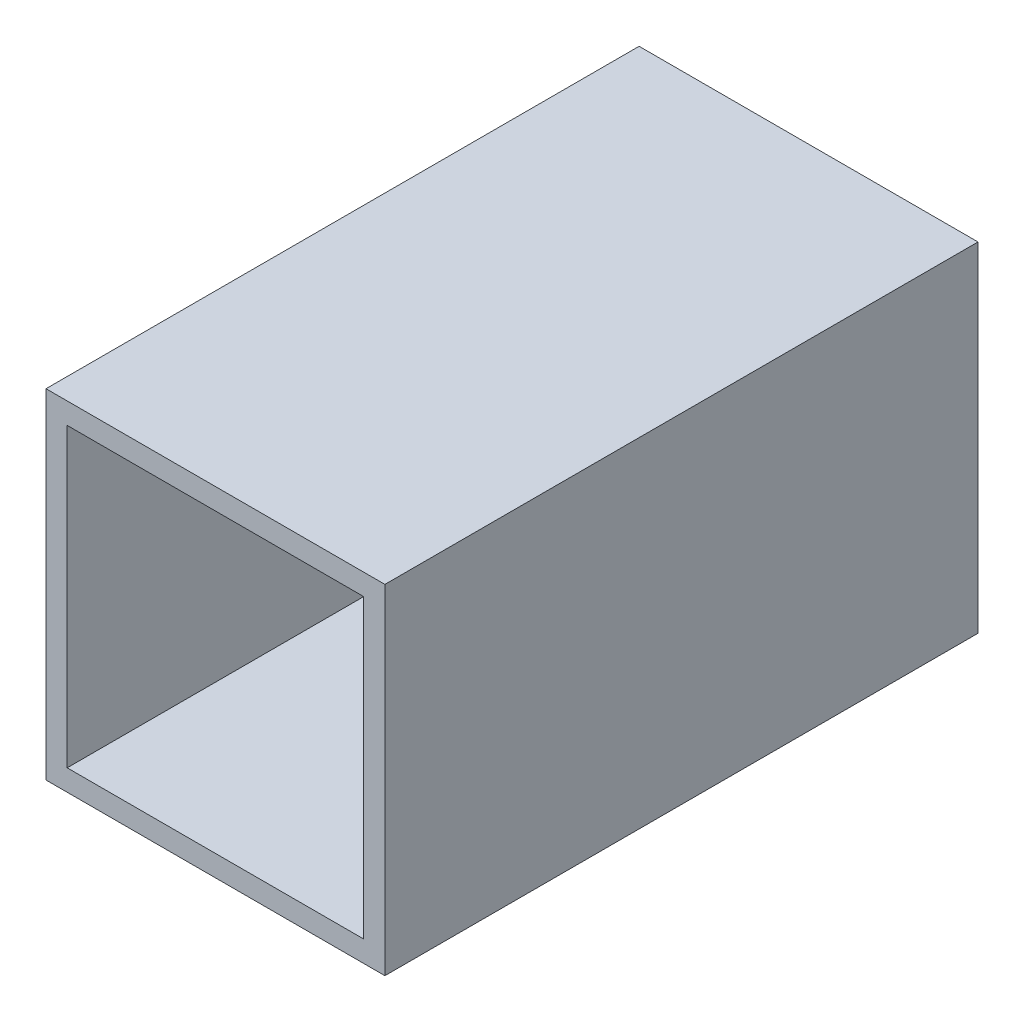
ISO-10303-21;
HEADER;
FILE_DESCRIPTION(('STEP AP214'),'2;1');
FILE_NAME('part.step','',(''),(''),'','','');
FILE_SCHEMA(('AUTOMOTIVE_DESIGN { 1 0 10303 214 1 1 1 1 }'));
ENDSEC;
DATA;
#1=APPLICATION_CONTEXT('core data for automotive mechanical design processes');
#2=APPLICATION_PROTOCOL_DEFINITION('international standard','automotive_design',2000,#1);
#3=PRODUCT_CONTEXT('',#1,'mechanical');
#4=PRODUCT('Part','Part','',(#3));
#5=PRODUCT_RELATED_PRODUCT_CATEGORY('part','',(#4));
#6=PRODUCT_DEFINITION_FORMATION('','',#4);
#7=PRODUCT_DEFINITION_CONTEXT('part definition',#1,'design');
#8=PRODUCT_DEFINITION('design','',#6,#7);
#9=PRODUCT_DEFINITION_SHAPE('','',#8);
#10=(LENGTH_UNIT() NAMED_UNIT(*) SI_UNIT(.MILLI.,.METRE.));
#11=(NAMED_UNIT(*) PLANE_ANGLE_UNIT() SI_UNIT($,.RADIAN.));
#12=(NAMED_UNIT(*) SI_UNIT($,.STERADIAN.) SOLID_ANGLE_UNIT());
#13=UNCERTAINTY_MEASURE_WITH_UNIT(LENGTH_MEASURE(1.E-05),#10,'distance_accuracy_value','');
#14=(GEOMETRIC_REPRESENTATION_CONTEXT(3) GLOBAL_UNCERTAINTY_ASSIGNED_CONTEXT((#13)) GLOBAL_UNIT_ASSIGNED_CONTEXT((#10,
#11,#12)) REPRESENTATION_CONTEXT('',''));
#15=CARTESIAN_POINT('',(0.,0.,0.));
#16=DIRECTION('',(0.,0.,1.));
#17=DIRECTION('',(1.,0.,0.));
#18=AXIS2_PLACEMENT_3D('',#15,#16,#17);
#19=CARTESIAN_POINT('',(0.,0.,44.45));
#20=DIRECTION('',(0.,0.,1.));
#21=DIRECTION('',(1.,0.,0.));
#22=AXIS2_PLACEMENT_3D('',#19,#20,#21);
#23=PLANE('',#22);
#24=DIRECTION('',(0.,1.,0.));
#25=VECTOR('',#24,1.);
#26=CARTESIAN_POINT('',(12.7,12.7,44.45));
#27=LINE('',#26,#25);
#28=CARTESIAN_POINT('',(12.7,-12.7,44.45));
#29=VERTEX_POINT('',#28);
#30=CARTESIAN_POINT('',(12.7,12.7,44.45));
#31=VERTEX_POINT('',#30);
#32=EDGE_CURVE('E135',#29,#31,#27,.T.);
#33=ORIENTED_EDGE('',*,*,#32,.T.);
#34=DIRECTION('',(-1.,0.,0.));
#35=VECTOR('',#34,1.);
#36=CARTESIAN_POINT('',(-12.7,12.7,44.45));
#37=LINE('',#36,#35);
#38=CARTESIAN_POINT('',(-12.7,12.7,44.45));
#39=VERTEX_POINT('',#38);
#40=EDGE_CURVE('E138',#31,#39,#37,.T.);
#41=ORIENTED_EDGE('',*,*,#40,.T.);
#42=DIRECTION('',(0.,-1.,0.));
#43=VECTOR('',#42,1.);
#44=CARTESIAN_POINT('',(-12.7,12.7,44.45));
#45=LINE('',#44,#43);
#46=CARTESIAN_POINT('',(-12.7,-12.7,44.45));
#47=VERTEX_POINT('',#46);
#48=EDGE_CURVE('E141',#39,#47,#45,.T.);
#49=ORIENTED_EDGE('',*,*,#48,.T.);
#50=DIRECTION('',(1.,0.,0.));
#51=VECTOR('',#50,1.);
#52=CARTESIAN_POINT('',(-12.7,-12.7,44.45));
#53=LINE('',#52,#51);
#54=EDGE_CURVE('E143',#47,#29,#53,.T.);
#55=ORIENTED_EDGE('',*,*,#54,.T.);
#56=EDGE_LOOP('',(#33,#41,#49,#55));
#57=FACE_BOUND('',#56,.T.);
#58=DIRECTION('',(1.,0.,0.));
#59=VECTOR('',#58,1.);
#60=CARTESIAN_POINT('',(11.1125,-11.1125,44.45));
#61=LINE('',#60,#59);
#62=CARTESIAN_POINT('',(-11.1125,-11.1125,44.45));
#63=VERTEX_POINT('',#62);
#64=CARTESIAN_POINT('',(11.1125,-11.1125,44.45));
#65=VERTEX_POINT('',#64);
#66=EDGE_CURVE('E107',#63,#65,#61,.T.);
#67=ORIENTED_EDGE('',*,*,#66,.F.);
#68=DIRECTION('',(0.,-1.,0.));
#69=VECTOR('',#68,1.);
#70=CARTESIAN_POINT('',(-11.1125,-11.1125,44.45));
#71=LINE('',#70,#69);
#72=CARTESIAN_POINT('',(-11.1125,11.1125,44.45));
#73=VERTEX_POINT('',#72);
#74=EDGE_CURVE('E99',#73,#63,#71,.T.);
#75=ORIENTED_EDGE('',*,*,#74,.F.);
#76=DIRECTION('',(-1.,0.,0.));
#77=VECTOR('',#76,1.);
#78=CARTESIAN_POINT('',(11.1125,11.1125,44.45));
#79=LINE('',#78,#77);
#80=CARTESIAN_POINT('',(11.1125,11.1125,44.45));
#81=VERTEX_POINT('',#80);
#82=EDGE_CURVE('E121',#81,#73,#79,.T.);
#83=ORIENTED_EDGE('',*,*,#82,.F.);
#84=DIRECTION('',(0.,1.,0.));
#85=VECTOR('',#84,1.);
#86=CARTESIAN_POINT('',(11.1125,-11.1125,44.45));
#87=LINE('',#86,#85);
#88=EDGE_CURVE('E119',#65,#81,#87,.T.);
#89=ORIENTED_EDGE('',*,*,#88,.F.);
#90=EDGE_LOOP('',(#67,#75,#83,#89));
#91=FACE_BOUND('',#90,.T.);
#92=ADVANCED_FACE('F34',(#57,#91),#23,.T.);
#93=CARTESIAN_POINT('',(0.,0.,0.));
#94=DIRECTION('',(0.,0.,1.));
#95=DIRECTION('',(1.,0.,0.));
#96=AXIS2_PLACEMENT_3D('',#93,#94,#95);
#97=PLANE('',#96);
#98=DIRECTION('',(0.,1.,0.));
#99=VECTOR('',#98,1.);
#100=CARTESIAN_POINT('',(12.7,12.7,0.));
#101=LINE('',#100,#99);
#102=CARTESIAN_POINT('',(12.7,-12.7,0.));
#103=VERTEX_POINT('',#102);
#104=CARTESIAN_POINT('',(12.7,12.7,0.));
#105=VERTEX_POINT('',#104);
#106=EDGE_CURVE('E115',#103,#105,#101,.T.);
#107=ORIENTED_EDGE('',*,*,#106,.F.);
#108=DIRECTION('',(1.,0.,0.));
#109=VECTOR('',#108,1.);
#110=CARTESIAN_POINT('',(-12.7,-12.7,0.));
#111=LINE('',#110,#109);
#112=CARTESIAN_POINT('',(-12.7,-12.7,0.));
#113=VERTEX_POINT('',#112);
#114=EDGE_CURVE('E139',#113,#103,#111,.T.);
#115=ORIENTED_EDGE('',*,*,#114,.F.);
#116=DIRECTION('',(0.,-1.,0.));
#117=VECTOR('',#116,1.);
#118=CARTESIAN_POINT('',(-12.7,12.7,0.));
#119=LINE('',#118,#117);
#120=CARTESIAN_POINT('',(-12.7,12.7,0.));
#121=VERTEX_POINT('',#120);
#122=EDGE_CURVE('E150',#121,#113,#119,.T.);
#123=ORIENTED_EDGE('',*,*,#122,.F.);
#124=DIRECTION('',(-1.,0.,0.));
#125=VECTOR('',#124,1.);
#126=CARTESIAN_POINT('',(-12.7,12.7,0.));
#127=LINE('',#126,#125);
#128=EDGE_CURVE('E148',#105,#121,#127,.T.);
#129=ORIENTED_EDGE('',*,*,#128,.F.);
#130=EDGE_LOOP('',(#107,#115,#123,#129));
#131=FACE_BOUND('',#130,.T.);
#132=DIRECTION('',(0.,-1.,0.));
#133=VECTOR('',#132,1.);
#134=CARTESIAN_POINT('',(-11.1125,-11.1125,0.));
#135=LINE('',#134,#133);
#136=CARTESIAN_POINT('',(-11.1125,11.1125,0.));
#137=VERTEX_POINT('',#136);
#138=CARTESIAN_POINT('',(-11.1125,-11.1125,0.));
#139=VERTEX_POINT('',#138);
#140=EDGE_CURVE('E57',#137,#139,#135,.T.);
#141=ORIENTED_EDGE('',*,*,#140,.T.);
#142=DIRECTION('',(1.,0.,0.));
#143=VECTOR('',#142,1.);
#144=CARTESIAN_POINT('',(11.1125,-11.1125,0.));
#145=LINE('',#144,#143);
#146=CARTESIAN_POINT('',(11.1125,-11.1125,0.));
#147=VERTEX_POINT('',#146);
#148=EDGE_CURVE('E114',#139,#147,#145,.T.);
#149=ORIENTED_EDGE('',*,*,#148,.T.);
#150=DIRECTION('',(0.,1.,0.));
#151=VECTOR('',#150,1.);
#152=CARTESIAN_POINT('',(11.1125,-11.1125,0.));
#153=LINE('',#152,#151);
#154=CARTESIAN_POINT('',(11.1125,11.1125,0.));
#155=VERTEX_POINT('',#154);
#156=EDGE_CURVE('E127',#147,#155,#153,.T.);
#157=ORIENTED_EDGE('',*,*,#156,.T.);
#158=DIRECTION('',(-1.,0.,0.));
#159=VECTOR('',#158,1.);
#160=CARTESIAN_POINT('',(11.1125,11.1125,0.));
#161=LINE('',#160,#159);
#162=EDGE_CURVE('E108',#155,#137,#161,.T.);
#163=ORIENTED_EDGE('',*,*,#162,.T.);
#164=EDGE_LOOP('',(#141,#149,#157,#163));
#165=FACE_BOUND('',#164,.T.);
#166=ADVANCED_FACE('F168',(#131,#165),#97,.F.);
#167=CARTESIAN_POINT('',(12.7,12.7,44.45));
#168=DIRECTION('',(-1.,0.,0.));
#169=DIRECTION('',(0.,0.,1.));
#170=AXIS2_PLACEMENT_3D('',#167,#168,#169);
#171=PLANE('',#170);
#172=ORIENTED_EDGE('',*,*,#106,.T.);
#173=DIRECTION('',(0.,0.,-1.));
#174=VECTOR('',#173,1.);
#175=CARTESIAN_POINT('',(12.7,12.7,44.45));
#176=LINE('',#175,#174);
#177=EDGE_CURVE('E11',#31,#105,#176,.T.);
#178=ORIENTED_EDGE('',*,*,#177,.F.);
#179=ORIENTED_EDGE('',*,*,#32,.F.);
#180=DIRECTION('',(0.,0.,-1.));
#181=VECTOR('',#180,1.);
#182=CARTESIAN_POINT('',(12.7,-12.7,44.45));
#183=LINE('',#182,#181);
#184=EDGE_CURVE('E145',#29,#103,#183,.T.);
#185=ORIENTED_EDGE('',*,*,#184,.T.);
#186=EDGE_LOOP('',(#172,#178,#179,#185));
#187=FACE_BOUND('',#186,.T.);
#188=ADVANCED_FACE('F36',(#187),#171,.F.);
#189=CARTESIAN_POINT('',(-12.7,12.7,44.45));
#190=DIRECTION('',(0.,-1.,0.));
#191=DIRECTION('',(0.,0.,-1.));
#192=AXIS2_PLACEMENT_3D('',#189,#190,#191);
#193=PLANE('',#192);
#194=ORIENTED_EDGE('',*,*,#128,.T.);
#195=DIRECTION('',(0.,0.,-1.));
#196=VECTOR('',#195,1.);
#197=CARTESIAN_POINT('',(-12.7,12.7,44.45));
#198=LINE('',#197,#196);
#199=EDGE_CURVE('E42',#39,#121,#198,.T.);
#200=ORIENTED_EDGE('',*,*,#199,.F.);
#201=ORIENTED_EDGE('',*,*,#40,.F.);
#202=ORIENTED_EDGE('',*,*,#177,.T.);
#203=EDGE_LOOP('',(#194,#200,#201,#202));
#204=FACE_BOUND('',#203,.T.);
#205=ADVANCED_FACE('F178',(#204),#193,.F.);
#206=CARTESIAN_POINT('',(-12.7,12.7,44.45));
#207=DIRECTION('',(1.,0.,0.));
#208=DIRECTION('',(0.,1.,0.));
#209=AXIS2_PLACEMENT_3D('',#206,#207,#208);
#210=PLANE('',#209);
#211=ORIENTED_EDGE('',*,*,#122,.T.);
#212=DIRECTION('',(0.,0.,-1.));
#213=VECTOR('',#212,1.);
#214=CARTESIAN_POINT('',(-12.7,-12.7,44.45));
#215=LINE('',#214,#213);
#216=EDGE_CURVE('E155',#47,#113,#215,.T.);
#217=ORIENTED_EDGE('',*,*,#216,.F.);
#218=ORIENTED_EDGE('',*,*,#48,.F.);
#219=ORIENTED_EDGE('',*,*,#199,.T.);
#220=EDGE_LOOP('',(#211,#217,#218,#219));
#221=FACE_BOUND('',#220,.T.);
#222=ADVANCED_FACE('F162',(#221),#210,.F.);
#223=CARTESIAN_POINT('',(-12.7,-12.7,44.45));
#224=DIRECTION('',(0.,1.,0.));
#225=DIRECTION('',(0.,0.,1.));
#226=AXIS2_PLACEMENT_3D('',#223,#224,#225);
#227=PLANE('',#226);
#228=ORIENTED_EDGE('',*,*,#114,.T.);
#229=ORIENTED_EDGE('',*,*,#184,.F.);
#230=ORIENTED_EDGE('',*,*,#54,.F.);
#231=ORIENTED_EDGE('',*,*,#216,.T.);
#232=EDGE_LOOP('',(#228,#229,#230,#231));
#233=FACE_BOUND('',#232,.T.);
#234=ADVANCED_FACE('F172',(#233),#227,.F.);
#235=CARTESIAN_POINT('',(-11.1125,-11.1125,44.45));
#236=DIRECTION('',(1.,0.,0.));
#237=DIRECTION('',(0.,0.,-1.));
#238=AXIS2_PLACEMENT_3D('',#235,#236,#237);
#239=PLANE('',#238);
#240=ORIENTED_EDGE('',*,*,#140,.F.);
#241=DIRECTION('',(0.,0.,-1.));
#242=VECTOR('',#241,1.);
#243=CARTESIAN_POINT('',(-11.1125,11.1125,44.45));
#244=LINE('',#243,#242);
#245=EDGE_CURVE('E103',#73,#137,#244,.T.);
#246=ORIENTED_EDGE('',*,*,#245,.F.);
#247=ORIENTED_EDGE('',*,*,#74,.T.);
#248=DIRECTION('',(0.,0.,-1.));
#249=VECTOR('',#248,1.);
#250=CARTESIAN_POINT('',(-11.1125,-11.1125,44.45));
#251=LINE('',#250,#249);
#252=EDGE_CURVE('E102',#63,#139,#251,.T.);
#253=ORIENTED_EDGE('',*,*,#252,.T.);
#254=EDGE_LOOP('',(#240,#246,#247,#253));
#255=FACE_BOUND('',#254,.T.);
#256=ADVANCED_FACE('F101',(#255),#239,.T.);
#257=CARTESIAN_POINT('',(11.1125,-11.1125,44.45));
#258=DIRECTION('',(0.,1.,0.));
#259=DIRECTION('',(0.,0.,1.));
#260=AXIS2_PLACEMENT_3D('',#257,#258,#259);
#261=PLANE('',#260);
#262=ORIENTED_EDGE('',*,*,#148,.F.);
#263=ORIENTED_EDGE('',*,*,#252,.F.);
#264=ORIENTED_EDGE('',*,*,#66,.T.);
#265=DIRECTION('',(0.,0.,-1.));
#266=VECTOR('',#265,1.);
#267=CARTESIAN_POINT('',(11.1125,-11.1125,44.45));
#268=LINE('',#267,#266);
#269=EDGE_CURVE('E116',#65,#147,#268,.T.);
#270=ORIENTED_EDGE('',*,*,#269,.T.);
#271=EDGE_LOOP('',(#262,#263,#264,#270));
#272=FACE_BOUND('',#271,.T.);
#273=ADVANCED_FACE('F111',(#272),#261,.T.);
#274=CARTESIAN_POINT('',(11.1125,-11.1125,44.45));
#275=DIRECTION('',(-1.,0.,0.));
#276=DIRECTION('',(0.,0.,1.));
#277=AXIS2_PLACEMENT_3D('',#274,#275,#276);
#278=PLANE('',#277);
#279=ORIENTED_EDGE('',*,*,#156,.F.);
#280=ORIENTED_EDGE('',*,*,#269,.F.);
#281=ORIENTED_EDGE('',*,*,#88,.T.);
#282=DIRECTION('',(0.,0.,-1.));
#283=VECTOR('',#282,1.);
#284=CARTESIAN_POINT('',(11.1125,11.1125,44.45));
#285=LINE('',#284,#283);
#286=EDGE_CURVE('E49',#81,#155,#285,.T.);
#287=ORIENTED_EDGE('',*,*,#286,.T.);
#288=EDGE_LOOP('',(#279,#280,#281,#287));
#289=FACE_BOUND('',#288,.T.);
#290=ADVANCED_FACE('F201',(#289),#278,.T.);
#291=CARTESIAN_POINT('',(11.1125,11.1125,44.45));
#292=DIRECTION('',(0.,-1.,0.));
#293=DIRECTION('',(0.,0.,-1.));
#294=AXIS2_PLACEMENT_3D('',#291,#292,#293);
#295=PLANE('',#294);
#296=ORIENTED_EDGE('',*,*,#162,.F.);
#297=ORIENTED_EDGE('',*,*,#286,.F.);
#298=ORIENTED_EDGE('',*,*,#82,.T.);
#299=ORIENTED_EDGE('',*,*,#245,.T.);
#300=EDGE_LOOP('',(#296,#297,#298,#299));
#301=FACE_BOUND('',#300,.T.);
#302=ADVANCED_FACE('F205',(#301),#295,.T.);
#303=CLOSED_SHELL('',(#92,#166,#188,#205,#222,#234,#256,#273,#290,#302));
#304=MANIFOLD_SOLID_BREP('B2',#303);
#305=ADVANCED_BREP_SHAPE_REPRESENTATION('',(#18,#304),#14);
#306=SHAPE_DEFINITION_REPRESENTATION(#9,#305);
ENDSEC;
END-ISO-10303-21;
